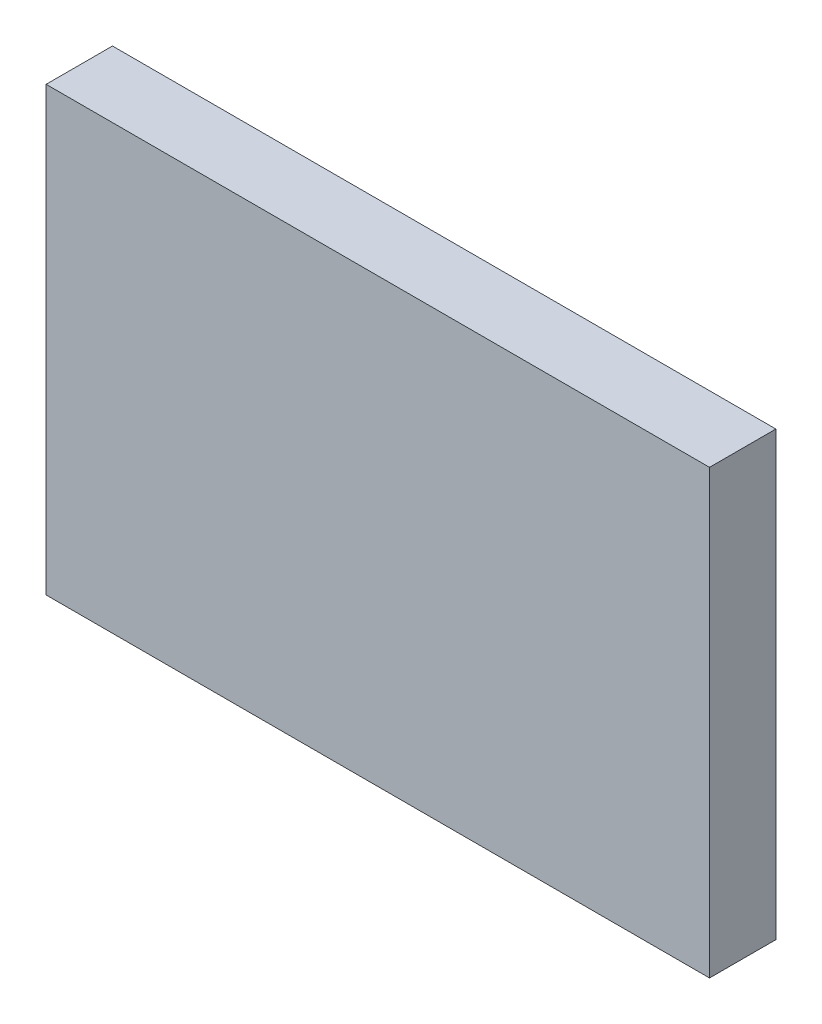
ISO-10303-21;
HEADER;
FILE_DESCRIPTION(('STEP AP214'),'2;1');
FILE_NAME('part.step','',(''),(''),'','','');
FILE_SCHEMA(('AUTOMOTIVE_DESIGN { 1 0 10303 214 1 1 1 1 }'));
ENDSEC;
DATA;
#1=APPLICATION_CONTEXT('core data for automotive mechanical design processes');
#2=APPLICATION_PROTOCOL_DEFINITION('international standard','automotive_design',2000,#1);
#3=PRODUCT_CONTEXT('',#1,'mechanical');
#4=PRODUCT('Part','Part','',(#3));
#5=PRODUCT_RELATED_PRODUCT_CATEGORY('part','',(#4));
#6=PRODUCT_DEFINITION_FORMATION('','',#4);
#7=PRODUCT_DEFINITION_CONTEXT('part definition',#1,'design');
#8=PRODUCT_DEFINITION('design','',#6,#7);
#9=PRODUCT_DEFINITION_SHAPE('','',#8);
#10=(LENGTH_UNIT() NAMED_UNIT(*) SI_UNIT(.MILLI.,.METRE.));
#11=(NAMED_UNIT(*) PLANE_ANGLE_UNIT() SI_UNIT($,.RADIAN.));
#12=(NAMED_UNIT(*) SI_UNIT($,.STERADIAN.) SOLID_ANGLE_UNIT());
#13=UNCERTAINTY_MEASURE_WITH_UNIT(LENGTH_MEASURE(1.E-05),#10,'distance_accuracy_value','');
#14=(GEOMETRIC_REPRESENTATION_CONTEXT(3) GLOBAL_UNCERTAINTY_ASSIGNED_CONTEXT((#13)) GLOBAL_UNIT_ASSIGNED_CONTEXT((#10,
#11,#12)) REPRESENTATION_CONTEXT('',''));
#15=CARTESIAN_POINT('',(0.,0.,0.));
#16=DIRECTION('',(0.,0.,1.));
#17=DIRECTION('',(1.,0.,0.));
#18=AXIS2_PLACEMENT_3D('',#15,#16,#17);
#19=CARTESIAN_POINT('',(0.,0.,3.));
#20=DIRECTION('',(1.,0.,0.));
#21=DIRECTION('',(0.,0.,-1.));
#22=AXIS2_PLACEMENT_3D('',#19,#20,#21);
#23=PLANE('',#22);
#24=DIRECTION('',(0.,-1.,0.));
#25=VECTOR('',#24,1.);
#26=CARTESIAN_POINT('',(0.,0.,0.));
#27=LINE('',#26,#25);
#28=CARTESIAN_POINT('',(0.,20.,0.));
#29=VERTEX_POINT('',#28);
#30=CARTESIAN_POINT('',(0.,0.,0.));
#31=VERTEX_POINT('',#30);
#32=EDGE_CURVE('E97',#29,#31,#27,.T.);
#33=ORIENTED_EDGE('',*,*,#32,.T.);
#34=DIRECTION('',(0.,0.,-1.));
#35=VECTOR('',#34,1.);
#36=CARTESIAN_POINT('',(0.,0.,3.));
#37=LINE('',#36,#35);
#38=CARTESIAN_POINT('',(0.,0.,3.));
#39=VERTEX_POINT('',#38);
#40=EDGE_CURVE('E11',#39,#31,#37,.T.);
#41=ORIENTED_EDGE('',*,*,#40,.F.);
#42=DIRECTION('',(0.,-1.,0.));
#43=VECTOR('',#42,1.);
#44=CARTESIAN_POINT('',(0.,0.,3.));
#45=LINE('',#44,#43);
#46=CARTESIAN_POINT('',(0.,20.,3.));
#47=VERTEX_POINT('',#46);
#48=EDGE_CURVE('E85',#47,#39,#45,.T.);
#49=ORIENTED_EDGE('',*,*,#48,.F.);
#50=DIRECTION('',(0.,0.,-1.));
#51=VECTOR('',#50,1.);
#52=CARTESIAN_POINT('',(0.,20.,3.));
#53=LINE('',#52,#51);
#54=EDGE_CURVE('E93',#47,#29,#53,.T.);
#55=ORIENTED_EDGE('',*,*,#54,.T.);
#56=EDGE_LOOP('',(#33,#41,#49,#55));
#57=FACE_BOUND('',#56,.T.);
#58=ADVANCED_FACE('F34',(#57),#23,.F.);
#59=CARTESIAN_POINT('',(0.,0.,3.));
#60=DIRECTION('',(0.,1.,0.));
#61=DIRECTION('',(0.,0.,1.));
#62=AXIS2_PLACEMENT_3D('',#59,#60,#61);
#63=PLANE('',#62);
#64=DIRECTION('',(1.,0.,0.));
#65=VECTOR('',#64,1.);
#66=CARTESIAN_POINT('',(0.,0.,0.));
#67=LINE('',#66,#65);
#68=CARTESIAN_POINT('',(30.,0.,0.));
#69=VERTEX_POINT('',#68);
#70=EDGE_CURVE('E89',#31,#69,#67,.T.);
#71=ORIENTED_EDGE('',*,*,#70,.T.);
#72=DIRECTION('',(0.,0.,-1.));
#73=VECTOR('',#72,1.);
#74=CARTESIAN_POINT('',(30.,0.,3.));
#75=LINE('',#74,#73);
#76=CARTESIAN_POINT('',(30.,0.,3.));
#77=VERTEX_POINT('',#76);
#78=EDGE_CURVE('E42',#77,#69,#75,.T.);
#79=ORIENTED_EDGE('',*,*,#78,.F.);
#80=DIRECTION('',(1.,0.,0.));
#81=VECTOR('',#80,1.);
#82=CARTESIAN_POINT('',(0.,0.,3.));
#83=LINE('',#82,#81);
#84=EDGE_CURVE('E80',#39,#77,#83,.T.);
#85=ORIENTED_EDGE('',*,*,#84,.F.);
#86=ORIENTED_EDGE('',*,*,#40,.T.);
#87=EDGE_LOOP('',(#71,#79,#85,#86));
#88=FACE_BOUND('',#87,.T.);
#89=ADVANCED_FACE('F88',(#88),#63,.F.);
#90=CARTESIAN_POINT('',(30.,0.,3.));
#91=DIRECTION('',(-1.,0.,0.));
#92=DIRECTION('',(0.,0.,1.));
#93=AXIS2_PLACEMENT_3D('',#90,#91,#92);
#94=PLANE('',#93);
#95=DIRECTION('',(0.,1.,0.));
#96=VECTOR('',#95,1.);
#97=CARTESIAN_POINT('',(30.,0.,0.));
#98=LINE('',#97,#96);
#99=CARTESIAN_POINT('',(30.,20.,0.));
#100=VERTEX_POINT('',#99);
#101=EDGE_CURVE('E67',#69,#100,#98,.T.);
#102=ORIENTED_EDGE('',*,*,#101,.T.);
#103=DIRECTION('',(0.,0.,-1.));
#104=VECTOR('',#103,1.);
#105=CARTESIAN_POINT('',(30.,20.,3.));
#106=LINE('',#105,#104);
#107=CARTESIAN_POINT('',(30.,20.,3.));
#108=VERTEX_POINT('',#107);
#109=EDGE_CURVE('E90',#108,#100,#106,.T.);
#110=ORIENTED_EDGE('',*,*,#109,.F.);
#111=DIRECTION('',(0.,1.,0.));
#112=VECTOR('',#111,1.);
#113=CARTESIAN_POINT('',(30.,0.,3.));
#114=LINE('',#113,#112);
#115=EDGE_CURVE('E83',#77,#108,#114,.T.);
#116=ORIENTED_EDGE('',*,*,#115,.F.);
#117=ORIENTED_EDGE('',*,*,#78,.T.);
#118=EDGE_LOOP('',(#102,#110,#116,#117));
#119=FACE_BOUND('',#118,.T.);
#120=ADVANCED_FACE('F91',(#119),#94,.F.);
#121=CARTESIAN_POINT('',(0.,20.,3.));
#122=DIRECTION('',(0.,-1.,0.));
#123=DIRECTION('',(0.,0.,-1.));
#124=AXIS2_PLACEMENT_3D('',#121,#122,#123);
#125=PLANE('',#124);
#126=DIRECTION('',(-1.,0.,0.));
#127=VECTOR('',#126,1.);
#128=CARTESIAN_POINT('',(0.,20.,0.));
#129=LINE('',#128,#127);
#130=EDGE_CURVE('E73',#100,#29,#129,.T.);
#131=ORIENTED_EDGE('',*,*,#130,.T.);
#132=ORIENTED_EDGE('',*,*,#54,.F.);
#133=DIRECTION('',(-1.,0.,0.));
#134=VECTOR('',#133,1.);
#135=CARTESIAN_POINT('',(0.,20.,3.));
#136=LINE('',#135,#134);
#137=EDGE_CURVE('E50',#108,#47,#136,.T.);
#138=ORIENTED_EDGE('',*,*,#137,.F.);
#139=ORIENTED_EDGE('',*,*,#109,.T.);
#140=EDGE_LOOP('',(#131,#132,#138,#139));
#141=FACE_BOUND('',#140,.T.);
#142=ADVANCED_FACE('F104',(#141),#125,.F.);
#143=CARTESIAN_POINT('',(0.,0.,3.));
#144=DIRECTION('',(0.,0.,-1.));
#145=DIRECTION('',(-1.,0.,0.));
#146=AXIS2_PLACEMENT_3D('',#143,#144,#145);
#147=PLANE('',#146);
#148=ORIENTED_EDGE('',*,*,#48,.T.);
#149=ORIENTED_EDGE('',*,*,#84,.T.);
#150=ORIENTED_EDGE('',*,*,#115,.T.);
#151=ORIENTED_EDGE('',*,*,#137,.T.);
#152=EDGE_LOOP('',(#148,#149,#150,#151));
#153=FACE_BOUND('',#152,.T.);
#154=ADVANCED_FACE('F81',(#153),#147,.F.);
#155=CARTESIAN_POINT('',(0.,0.,0.));
#156=DIRECTION('',(0.,0.,-1.));
#157=DIRECTION('',(-1.,0.,0.));
#158=AXIS2_PLACEMENT_3D('',#155,#156,#157);
#159=PLANE('',#158);
#160=ORIENTED_EDGE('',*,*,#32,.F.);
#161=ORIENTED_EDGE('',*,*,#130,.F.);
#162=ORIENTED_EDGE('',*,*,#101,.F.);
#163=ORIENTED_EDGE('',*,*,#70,.F.);
#164=EDGE_LOOP('',(#160,#161,#162,#163));
#165=FACE_BOUND('',#164,.T.);
#166=ADVANCED_FACE('F107',(#165),#159,.T.);
#167=CLOSED_SHELL('',(#58,#89,#120,#142,#154,#166));
#168=MANIFOLD_SOLID_BREP('B2',#167);
#169=ADVANCED_BREP_SHAPE_REPRESENTATION('',(#18,#168),#14);
#170=SHAPE_DEFINITION_REPRESENTATION(#9,#169);
ENDSEC;
END-ISO-10303-21;
